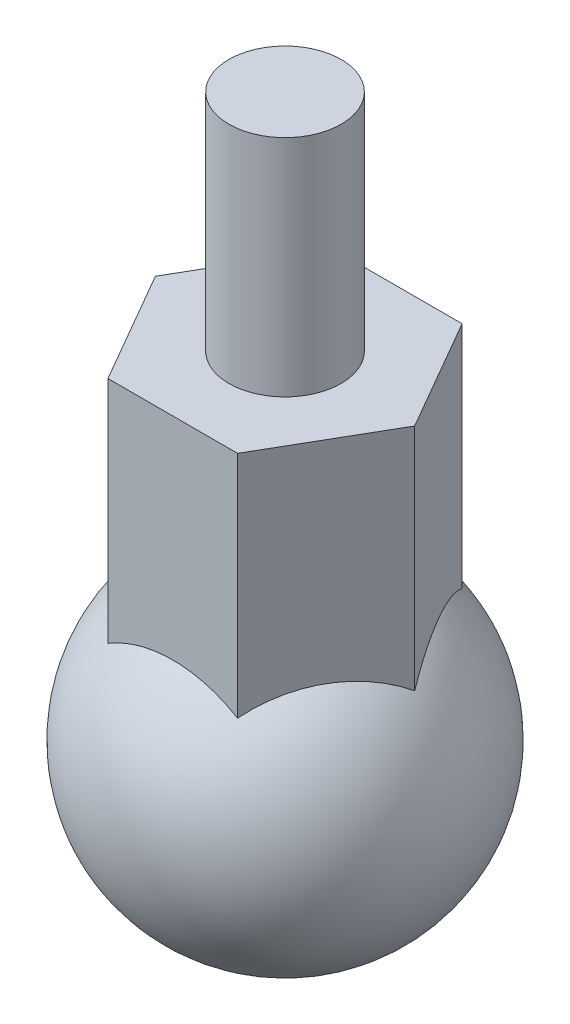
ISO-10303-21;
HEADER;
FILE_DESCRIPTION(('STEP AP214'),'2;1');
FILE_NAME('part.step','',(''),(''),'','','');
FILE_SCHEMA(('AUTOMOTIVE_DESIGN { 1 0 10303 214 1 1 1 1 }'));
ENDSEC;
DATA;
#1=APPLICATION_CONTEXT('core data for automotive mechanical design processes');
#2=APPLICATION_PROTOCOL_DEFINITION('international standard','automotive_design',2000,#1);
#3=PRODUCT_CONTEXT('',#1,'mechanical');
#4=PRODUCT('Part','Part','',(#3));
#5=PRODUCT_RELATED_PRODUCT_CATEGORY('part','',(#4));
#6=PRODUCT_DEFINITION_FORMATION('','',#4);
#7=PRODUCT_DEFINITION_CONTEXT('part definition',#1,'design');
#8=PRODUCT_DEFINITION('design','',#6,#7);
#9=PRODUCT_DEFINITION_SHAPE('','',#8);
#10=(LENGTH_UNIT() NAMED_UNIT(*) SI_UNIT(.MILLI.,.METRE.));
#11=(NAMED_UNIT(*) PLANE_ANGLE_UNIT() SI_UNIT($,.RADIAN.));
#12=(NAMED_UNIT(*) SI_UNIT($,.STERADIAN.) SOLID_ANGLE_UNIT());
#13=UNCERTAINTY_MEASURE_WITH_UNIT(LENGTH_MEASURE(1.E-05),#10,'distance_accuracy_value','');
#14=(GEOMETRIC_REPRESENTATION_CONTEXT(3) GLOBAL_UNCERTAINTY_ASSIGNED_CONTEXT((#13)) GLOBAL_UNIT_ASSIGNED_CONTEXT((#10,
#11,#12)) REPRESENTATION_CONTEXT('',''));
#15=CARTESIAN_POINT('',(0.,0.,0.));
#16=DIRECTION('',(0.,0.,1.));
#17=DIRECTION('',(1.,0.,0.));
#18=AXIS2_PLACEMENT_3D('',#15,#16,#17);
#19=CARTESIAN_POINT('',(0.,10.,0.));
#20=DIRECTION('',(0.,-1.,0.));
#21=DIRECTION('',(0.,0.,-1.));
#22=AXIS2_PLACEMENT_3D('',#19,#20,#21);
#23=CYLINDRICAL_SURFACE('',#22,1.);
#24=CARTESIAN_POINT('',(0.,6.,0.));
#25=DIRECTION('',(0.,1.,0.));
#26=DIRECTION('',(0.,0.,1.));
#27=AXIS2_PLACEMENT_3D('',#24,#25,#26);
#28=CIRCLE('',#27,1.);
#29=CARTESIAN_POINT('',(0.,6.,1.));
#30=VERTEX_POINT('',#29);
#31=EDGE_CURVE('E104',#30,#30,#28,.T.);
#32=ORIENTED_EDGE('',*,*,#31,.T.);
#33=EDGE_LOOP('',(#32));
#34=FACE_BOUND('',#33,.T.);
#35=CARTESIAN_POINT('',(0.,10.,0.));
#36=DIRECTION('',(0.,1.,0.));
#37=DIRECTION('',(0.,0.,1.));
#38=AXIS2_PLACEMENT_3D('',#35,#36,#37);
#39=CIRCLE('',#38,1.);
#40=CARTESIAN_POINT('',(0.,10.,1.));
#41=VERTEX_POINT('',#40);
#42=EDGE_CURVE('E107',#41,#41,#39,.T.);
#43=ORIENTED_EDGE('',*,*,#42,.F.);
#44=EDGE_LOOP('',(#43));
#45=FACE_BOUND('',#44,.T.);
#46=ADVANCED_FACE('F34',(#34,#45),#23,.T.);
#47=CARTESIAN_POINT('',(0.,10.,0.));
#48=DIRECTION('',(0.,1.,0.));
#49=DIRECTION('',(0.,0.,1.));
#50=AXIS2_PLACEMENT_3D('',#47,#48,#49);
#51=PLANE('',#50);
#52=ORIENTED_EDGE('',*,*,#42,.T.);
#53=EDGE_LOOP('',(#52));
#54=FACE_BOUND('',#53,.T.);
#55=ADVANCED_FACE('F159',(#54),#51,.T.);
#56=CARTESIAN_POINT('',(1.15470053837925,6.,2.));
#57=DIRECTION('',(-0.866025403784439,0.,-0.5));
#58=DIRECTION('',(-0.5,0.,0.866025403784439));
#59=AXIS2_PLACEMENT_3D('',#56,#57,#58);
#60=PLANE('',#59);
#61=DIRECTION('',(0.,-1.,0.));
#62=VECTOR('',#61,1.);
#63=CARTESIAN_POINT('',(1.15470053837925,6.,2.));
#64=LINE('',#63,#62);
#65=CARTESIAN_POINT('',(1.15470053837925,6.,2.));
#66=VERTEX_POINT('',#65);
#67=CARTESIAN_POINT('',(1.15470053837925,1.91485421551268,2.));
#68=VERTEX_POINT('',#67);
#69=EDGE_CURVE('E136',#66,#68,#64,.T.);
#70=ORIENTED_EDGE('',*,*,#69,.T.);
#71=CARTESIAN_POINT('',(1.73205080756888,0.,0.999999999999999));
#72=DIRECTION('',(-0.866025403784439,0.,-0.5));
#73=DIRECTION('',(-0.5,0.,0.866025403784439));
#74=AXIS2_PLACEMENT_3D('',#71,#72,#73);
#75=CIRCLE('',#74,2.23606797749979);
#76=CARTESIAN_POINT('',(2.3094010767585,1.91485421551268,0.));
#77=VERTEX_POINT('',#76);
#78=EDGE_CURVE('E11',#68,#77,#75,.T.);
#79=ORIENTED_EDGE('',*,*,#78,.T.);
#80=DIRECTION('',(0.,-1.,0.));
#81=VECTOR('',#80,1.);
#82=CARTESIAN_POINT('',(2.3094010767585,6.,0.));
#83=LINE('',#82,#81);
#84=CARTESIAN_POINT('',(2.3094010767585,6.,0.));
#85=VERTEX_POINT('',#84);
#86=EDGE_CURVE('E87',#85,#77,#83,.T.);
#87=ORIENTED_EDGE('',*,*,#86,.F.);
#88=DIRECTION('',(0.5,0.,-0.866025403784439));
#89=VECTOR('',#88,1.);
#90=CARTESIAN_POINT('',(1.15470053837925,6.,2.));
#91=LINE('',#90,#89);
#92=EDGE_CURVE('E93',#66,#85,#91,.T.);
#93=ORIENTED_EDGE('',*,*,#92,.F.);
#94=EDGE_LOOP('',(#70,#79,#87,#93));
#95=FACE_BOUND('',#94,.T.);
#96=ADVANCED_FACE('F103',(#95),#60,.F.);
#97=CARTESIAN_POINT('',(2.3094010767585,6.,0.));
#98=DIRECTION('',(-0.866025403784439,0.,0.5));
#99=DIRECTION('',(0.5,0.,0.866025403784439));
#100=AXIS2_PLACEMENT_3D('',#97,#98,#99);
#101=PLANE('',#100);
#102=ORIENTED_EDGE('',*,*,#86,.T.);
#103=CARTESIAN_POINT('',(1.73205080756888,0.,-1.));
#104=DIRECTION('',(-0.866025403784439,0.,0.5));
#105=DIRECTION('',(0.5,0.,0.866025403784439));
#106=AXIS2_PLACEMENT_3D('',#103,#104,#105);
#107=CIRCLE('',#106,2.23606797749979);
#108=CARTESIAN_POINT('',(1.15470053837925,1.91485421551268,-2.));
#109=VERTEX_POINT('',#108);
#110=EDGE_CURVE('E42',#77,#109,#107,.T.);
#111=ORIENTED_EDGE('',*,*,#110,.T.);
#112=DIRECTION('',(0.,-1.,0.));
#113=VECTOR('',#112,1.);
#114=CARTESIAN_POINT('',(1.15470053837925,6.,-2.));
#115=LINE('',#114,#113);
#116=CARTESIAN_POINT('',(1.15470053837925,6.,-2.));
#117=VERTEX_POINT('',#116);
#118=EDGE_CURVE('E89',#117,#109,#115,.T.);
#119=ORIENTED_EDGE('',*,*,#118,.F.);
#120=DIRECTION('',(-0.5,0.,-0.866025403784438));
#121=VECTOR('',#120,1.);
#122=CARTESIAN_POINT('',(2.3094010767585,6.,0.));
#123=LINE('',#122,#121);
#124=EDGE_CURVE('E83',#85,#117,#123,.T.);
#125=ORIENTED_EDGE('',*,*,#124,.F.);
#126=EDGE_LOOP('',(#102,#111,#119,#125));
#127=FACE_BOUND('',#126,.T.);
#128=ADVANCED_FACE('F85',(#127),#101,.F.);
#129=CARTESIAN_POINT('',(1.15470053837925,6.,-2.));
#130=DIRECTION('',(0.,0.,1.));
#131=DIRECTION('',(1.,0.,0.));
#132=AXIS2_PLACEMENT_3D('',#129,#130,#131);
#133=PLANE('',#132);
#134=ORIENTED_EDGE('',*,*,#118,.T.);
#135=CARTESIAN_POINT('',(0.,0.,-2.));
#136=DIRECTION('',(0.,0.,1.));
#137=DIRECTION('',(1.,0.,0.));
#138=AXIS2_PLACEMENT_3D('',#135,#136,#137);
#139=CIRCLE('',#138,2.23606797749979);
#140=CARTESIAN_POINT('',(-1.15470053837925,1.91485421551268,-2.));
#141=VERTEX_POINT('',#140);
#142=EDGE_CURVE('E52',#109,#141,#139,.T.);
#143=ORIENTED_EDGE('',*,*,#142,.T.);
#144=DIRECTION('',(0.,-1.,0.));
#145=VECTOR('',#144,1.);
#146=CARTESIAN_POINT('',(-1.15470053837925,6.,-2.));
#147=LINE('',#146,#145);
#148=CARTESIAN_POINT('',(-1.15470053837925,6.,-2.));
#149=VERTEX_POINT('',#148);
#150=EDGE_CURVE('E109',#149,#141,#147,.T.);
#151=ORIENTED_EDGE('',*,*,#150,.F.);
#152=DIRECTION('',(-1.,0.,0.));
#153=VECTOR('',#152,1.);
#154=CARTESIAN_POINT('',(1.15470053837925,6.,-2.));
#155=LINE('',#154,#153);
#156=EDGE_CURVE('E92',#117,#149,#155,.T.);
#157=ORIENTED_EDGE('',*,*,#156,.F.);
#158=EDGE_LOOP('',(#134,#143,#151,#157));
#159=FACE_BOUND('',#158,.T.);
#160=ADVANCED_FACE('F125',(#159),#133,.F.);
#161=CARTESIAN_POINT('',(-1.15470053837925,6.,-2.));
#162=DIRECTION('',(0.866025403784439,0.,0.5));
#163=DIRECTION('',(0.5,0.,-0.866025403784439));
#164=AXIS2_PLACEMENT_3D('',#161,#162,#163);
#165=PLANE('',#164);
#166=ORIENTED_EDGE('',*,*,#150,.T.);
#167=CARTESIAN_POINT('',(-1.73205080756888,0.,-1.));
#168=DIRECTION('',(0.866025403784439,0.,0.5));
#169=DIRECTION('',(0.5,0.,-0.866025403784439));
#170=AXIS2_PLACEMENT_3D('',#167,#168,#169);
#171=CIRCLE('',#170,2.23606797749979);
#172=CARTESIAN_POINT('',(-2.3094010767585,1.91485421551268,0.));
#173=VERTEX_POINT('',#172);
#174=EDGE_CURVE('E121',#141,#173,#171,.T.);
#175=ORIENTED_EDGE('',*,*,#174,.T.);
#176=DIRECTION('',(0.,-1.,0.));
#177=VECTOR('',#176,1.);
#178=CARTESIAN_POINT('',(-2.3094010767585,6.,0.));
#179=LINE('',#178,#177);
#180=CARTESIAN_POINT('',(-2.3094010767585,6.,0.));
#181=VERTEX_POINT('',#180);
#182=EDGE_CURVE('E141',#181,#173,#179,.T.);
#183=ORIENTED_EDGE('',*,*,#182,.F.);
#184=DIRECTION('',(-0.5,0.,0.866025403784439));
#185=VECTOR('',#184,1.);
#186=CARTESIAN_POINT('',(-1.15470053837925,6.,-2.));
#187=LINE('',#186,#185);
#188=EDGE_CURVE('E129',#149,#181,#187,.T.);
#189=ORIENTED_EDGE('',*,*,#188,.F.);
#190=EDGE_LOOP('',(#166,#175,#183,#189));
#191=FACE_BOUND('',#190,.T.);
#192=ADVANCED_FACE('F144',(#191),#165,.F.);
#193=CARTESIAN_POINT('',(-2.3094010767585,6.,0.));
#194=DIRECTION('',(0.866025403784439,0.,-0.5));
#195=DIRECTION('',(-0.5,0.,-0.866025403784439));
#196=AXIS2_PLACEMENT_3D('',#193,#194,#195);
#197=PLANE('',#196);
#198=ORIENTED_EDGE('',*,*,#182,.T.);
#199=CARTESIAN_POINT('',(-1.73205080756888,0.,1.));
#200=DIRECTION('',(0.866025403784439,0.,-0.5));
#201=DIRECTION('',(-0.5,0.,-0.866025403784439));
#202=AXIS2_PLACEMENT_3D('',#199,#200,#201);
#203=CIRCLE('',#202,2.23606797749979);
#204=CARTESIAN_POINT('',(-1.15470053837925,1.91485421551268,2.));
#205=VERTEX_POINT('',#204);
#206=EDGE_CURVE('E118',#173,#205,#203,.T.);
#207=ORIENTED_EDGE('',*,*,#206,.T.);
#208=DIRECTION('',(0.,-1.,0.));
#209=VECTOR('',#208,1.);
#210=CARTESIAN_POINT('',(-1.15470053837925,6.,2.));
#211=LINE('',#210,#209);
#212=CARTESIAN_POINT('',(-1.15470053837925,6.,2.));
#213=VERTEX_POINT('',#212);
#214=EDGE_CURVE('E138',#213,#205,#211,.T.);
#215=ORIENTED_EDGE('',*,*,#214,.F.);
#216=DIRECTION('',(0.5,0.,0.866025403784438));
#217=VECTOR('',#216,1.);
#218=CARTESIAN_POINT('',(-2.3094010767585,6.,0.));
#219=LINE('',#218,#217);
#220=EDGE_CURVE('E131',#181,#213,#219,.T.);
#221=ORIENTED_EDGE('',*,*,#220,.F.);
#222=EDGE_LOOP('',(#198,#207,#215,#221));
#223=FACE_BOUND('',#222,.T.);
#224=ADVANCED_FACE('F149',(#223),#197,.F.);
#225=CARTESIAN_POINT('',(-1.15470053837925,6.,2.));
#226=DIRECTION('',(0.,0.,-1.));
#227=DIRECTION('',(-1.,0.,0.));
#228=AXIS2_PLACEMENT_3D('',#225,#226,#227);
#229=PLANE('',#228);
#230=ORIENTED_EDGE('',*,*,#214,.T.);
#231=CARTESIAN_POINT('',(0.,0.,2.));
#232=DIRECTION('',(0.,0.,-1.));
#233=DIRECTION('',(-1.,0.,0.));
#234=AXIS2_PLACEMENT_3D('',#231,#232,#233);
#235=CIRCLE('',#234,2.23606797749979);
#236=EDGE_CURVE('E114',#205,#68,#235,.T.);
#237=ORIENTED_EDGE('',*,*,#236,.T.);
#238=ORIENTED_EDGE('',*,*,#69,.F.);
#239=DIRECTION('',(1.,0.,0.));
#240=VECTOR('',#239,1.);
#241=CARTESIAN_POINT('',(-1.15470053837925,6.,2.));
#242=LINE('',#241,#240);
#243=EDGE_CURVE('E98',#213,#66,#242,.T.);
#244=ORIENTED_EDGE('',*,*,#243,.F.);
#245=EDGE_LOOP('',(#230,#237,#238,#244));
#246=FACE_BOUND('',#245,.T.);
#247=ADVANCED_FACE('F151',(#246),#229,.F.);
#248=CARTESIAN_POINT('',(0.,6.,0.));
#249=DIRECTION('',(0.,1.,0.));
#250=DIRECTION('',(0.,0.,1.));
#251=AXIS2_PLACEMENT_3D('',#248,#249,#250);
#252=PLANE('',#251);
#253=ORIENTED_EDGE('',*,*,#31,.F.);
#254=EDGE_LOOP('',(#253));
#255=FACE_BOUND('',#254,.T.);
#256=ORIENTED_EDGE('',*,*,#92,.T.);
#257=ORIENTED_EDGE('',*,*,#124,.T.);
#258=ORIENTED_EDGE('',*,*,#156,.T.);
#259=ORIENTED_EDGE('',*,*,#188,.T.);
#260=ORIENTED_EDGE('',*,*,#220,.T.);
#261=ORIENTED_EDGE('',*,*,#243,.T.);
#262=EDGE_LOOP('',(#256,#257,#258,#259,#260,#261));
#263=FACE_BOUND('',#262,.T.);
#264=ADVANCED_FACE('F96',(#255,#263),#252,.T.);
#265=CARTESIAN_POINT('',(0.,0.,0.));
#266=DIRECTION('',(0.,0.,-1.));
#267=DIRECTION('',(1.,0.,0.));
#268=AXIS2_PLACEMENT_3D('',#265,#266,#267);
#269=SPHERICAL_SURFACE('',#268,3.);
#270=ORIENTED_EDGE('',*,*,#78,.F.);
#271=ORIENTED_EDGE('',*,*,#236,.F.);
#272=ORIENTED_EDGE('',*,*,#206,.F.);
#273=ORIENTED_EDGE('',*,*,#174,.F.);
#274=ORIENTED_EDGE('',*,*,#142,.F.);
#275=ORIENTED_EDGE('',*,*,#110,.F.);
#276=EDGE_LOOP('',(#270,#271,#272,#273,#274,#275));
#277=FACE_BOUND('',#276,.T.);
#278=ADVANCED_FACE('F36',(#277),#269,.T.);
#279=CLOSED_SHELL('',(#46,#55,#96,#128,#160,#192,#224,#247,#264,#278));
#280=MANIFOLD_SOLID_BREP('B2',#279);
#281=ADVANCED_BREP_SHAPE_REPRESENTATION('',(#18,#280),#14);
#282=SHAPE_DEFINITION_REPRESENTATION(#9,#281);
ENDSEC;
END-ISO-10303-21;
